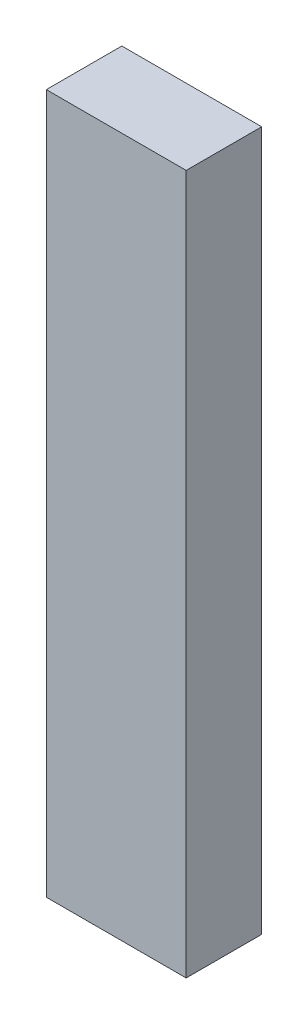
ISO-10303-21;
HEADER;
FILE_DESCRIPTION(('STEP AP214'),'2;1');
FILE_NAME('part.step','',(''),(''),'','','');
FILE_SCHEMA(('AUTOMOTIVE_DESIGN { 1 0 10303 214 1 1 1 1 }'));
ENDSEC;
DATA;
#1=APPLICATION_CONTEXT('core data for automotive mechanical design processes');
#2=APPLICATION_PROTOCOL_DEFINITION('international standard','automotive_design',2000,#1);
#3=PRODUCT_CONTEXT('',#1,'mechanical');
#4=PRODUCT('Part','Part','',(#3));
#5=PRODUCT_RELATED_PRODUCT_CATEGORY('part','',(#4));
#6=PRODUCT_DEFINITION_FORMATION('','',#4);
#7=PRODUCT_DEFINITION_CONTEXT('part definition',#1,'design');
#8=PRODUCT_DEFINITION('design','',#6,#7);
#9=PRODUCT_DEFINITION_SHAPE('','',#8);
#10=(LENGTH_UNIT() NAMED_UNIT(*) SI_UNIT(.MILLI.,.METRE.));
#11=(NAMED_UNIT(*) PLANE_ANGLE_UNIT() SI_UNIT($,.RADIAN.));
#12=(NAMED_UNIT(*) SI_UNIT($,.STERADIAN.) SOLID_ANGLE_UNIT());
#13=UNCERTAINTY_MEASURE_WITH_UNIT(LENGTH_MEASURE(1.E-05),#10,'distance_accuracy_value','');
#14=(GEOMETRIC_REPRESENTATION_CONTEXT(3) GLOBAL_UNCERTAINTY_ASSIGNED_CONTEXT((#13)) GLOBAL_UNIT_ASSIGNED_CONTEXT((#10,
#11,#12)) REPRESENTATION_CONTEXT('',''));
#15=CARTESIAN_POINT('',(0.,0.,0.));
#16=DIRECTION('',(0.,0.,1.));
#17=DIRECTION('',(1.,0.,0.));
#18=AXIS2_PLACEMENT_3D('',#15,#16,#17);
#19=CARTESIAN_POINT('',(50.,500.,27.));
#20=DIRECTION('',(-1.,0.,0.));
#21=DIRECTION('',(0.,0.,1.));
#22=AXIS2_PLACEMENT_3D('',#19,#20,#21);
#23=PLANE('',#22);
#24=DIRECTION('',(0.,0.,-1.));
#25=VECTOR('',#24,1.);
#26=CARTESIAN_POINT('',(50.,0.,27.));
#27=LINE('',#26,#25);
#28=CARTESIAN_POINT('',(50.,0.,27.));
#29=VERTEX_POINT('',#28);
#30=CARTESIAN_POINT('',(50.,0.,-27.));
#31=VERTEX_POINT('',#30);
#32=EDGE_CURVE('E113',#29,#31,#27,.T.);
#33=ORIENTED_EDGE('',*,*,#32,.T.);
#34=DIRECTION('',(0.,-1.,0.));
#35=VECTOR('',#34,1.);
#36=CARTESIAN_POINT('',(50.,500.,-27.));
#37=LINE('',#36,#35);
#38=CARTESIAN_POINT('',(50.,500.,-27.));
#39=VERTEX_POINT('',#38);
#40=EDGE_CURVE('E11',#39,#31,#37,.T.);
#41=ORIENTED_EDGE('',*,*,#40,.F.);
#42=DIRECTION('',(0.,0.,-1.));
#43=VECTOR('',#42,1.);
#44=CARTESIAN_POINT('',(50.,500.,27.));
#45=LINE('',#44,#43);
#46=CARTESIAN_POINT('',(50.,500.,27.));
#47=VERTEX_POINT('',#46);
#48=EDGE_CURVE('E95',#47,#39,#45,.T.);
#49=ORIENTED_EDGE('',*,*,#48,.F.);
#50=DIRECTION('',(0.,-1.,0.));
#51=VECTOR('',#50,1.);
#52=CARTESIAN_POINT('',(50.,500.,27.));
#53=LINE('',#52,#51);
#54=EDGE_CURVE('E62',#47,#29,#53,.T.);
#55=ORIENTED_EDGE('',*,*,#54,.T.);
#56=EDGE_LOOP('',(#33,#41,#49,#55));
#57=FACE_BOUND('',#56,.T.);
#58=ADVANCED_FACE('F45',(#57),#23,.F.);
#59=CARTESIAN_POINT('',(50.,500.,-27.));
#60=DIRECTION('',(0.,0.,1.));
#61=DIRECTION('',(1.,0.,0.));
#62=AXIS2_PLACEMENT_3D('',#59,#60,#61);
#63=PLANE('',#62);
#64=DIRECTION('',(-1.,0.,0.));
#65=VECTOR('',#64,1.);
#66=CARTESIAN_POINT('',(50.,0.,-27.));
#67=LINE('',#66,#65);
#68=CARTESIAN_POINT('',(-50.,0.,-27.));
#69=VERTEX_POINT('',#68);
#70=EDGE_CURVE('E101',#31,#69,#67,.T.);
#71=ORIENTED_EDGE('',*,*,#70,.T.);
#72=DIRECTION('',(0.,-1.,0.));
#73=VECTOR('',#72,1.);
#74=CARTESIAN_POINT('',(-50.,500.,-27.));
#75=LINE('',#74,#73);
#76=CARTESIAN_POINT('',(-50.,500.,-27.));
#77=VERTEX_POINT('',#76);
#78=EDGE_CURVE('E54',#77,#69,#75,.T.);
#79=ORIENTED_EDGE('',*,*,#78,.F.);
#80=DIRECTION('',(-1.,0.,0.));
#81=VECTOR('',#80,1.);
#82=CARTESIAN_POINT('',(50.,500.,-27.));
#83=LINE('',#82,#81);
#84=EDGE_CURVE('E87',#39,#77,#83,.T.);
#85=ORIENTED_EDGE('',*,*,#84,.F.);
#86=ORIENTED_EDGE('',*,*,#40,.T.);
#87=EDGE_LOOP('',(#71,#79,#85,#86));
#88=FACE_BOUND('',#87,.T.);
#89=ADVANCED_FACE('F100',(#88),#63,.F.);
#90=CARTESIAN_POINT('',(-50.,500.,27.));
#91=DIRECTION('',(-1.,0.,0.));
#92=DIRECTION('',(0.,0.,1.));
#93=AXIS2_PLACEMENT_3D('',#90,#91,#92);
#94=PLANE('',#93);
#95=DIRECTION('',(0.,0.,-1.));
#96=VECTOR('',#95,1.);
#97=CARTESIAN_POINT('',(-50.,0.,27.));
#98=LINE('',#97,#96);
#99=CARTESIAN_POINT('',(-50.,0.,27.));
#100=VERTEX_POINT('',#99);
#101=EDGE_CURVE('E118',#100,#69,#98,.T.);
#102=ORIENTED_EDGE('',*,*,#101,.F.);
#103=DIRECTION('',(0.,-1.,0.));
#104=VECTOR('',#103,1.);
#105=CARTESIAN_POINT('',(-50.,500.,27.));
#106=LINE('',#105,#104);
#107=CARTESIAN_POINT('',(-50.,500.,27.));
#108=VERTEX_POINT('',#107);
#109=EDGE_CURVE('E76',#108,#100,#106,.T.);
#110=ORIENTED_EDGE('',*,*,#109,.F.);
#111=DIRECTION('',(0.,0.,-1.));
#112=VECTOR('',#111,1.);
#113=CARTESIAN_POINT('',(-50.,500.,27.));
#114=LINE('',#113,#112);
#115=EDGE_CURVE('E94',#108,#77,#114,.T.);
#116=ORIENTED_EDGE('',*,*,#115,.T.);
#117=ORIENTED_EDGE('',*,*,#78,.T.);
#118=EDGE_LOOP('',(#102,#110,#116,#117));
#119=FACE_BOUND('',#118,.T.);
#120=ADVANCED_FACE('F105',(#119),#94,.T.);
#121=CARTESIAN_POINT('',(50.,500.,27.));
#122=DIRECTION('',(0.,0.,1.));
#123=DIRECTION('',(1.,0.,0.));
#124=AXIS2_PLACEMENT_3D('',#121,#122,#123);
#125=PLANE('',#124);
#126=DIRECTION('',(-1.,0.,0.));
#127=VECTOR('',#126,1.);
#128=CARTESIAN_POINT('',(50.,0.,27.));
#129=LINE('',#128,#127);
#130=EDGE_CURVE('E121',#29,#100,#129,.T.);
#131=ORIENTED_EDGE('',*,*,#130,.F.);
#132=ORIENTED_EDGE('',*,*,#54,.F.);
#133=DIRECTION('',(-1.,0.,0.));
#134=VECTOR('',#133,1.);
#135=CARTESIAN_POINT('',(50.,500.,27.));
#136=LINE('',#135,#134);
#137=EDGE_CURVE('E107',#47,#108,#136,.T.);
#138=ORIENTED_EDGE('',*,*,#137,.T.);
#139=ORIENTED_EDGE('',*,*,#109,.T.);
#140=EDGE_LOOP('',(#131,#132,#138,#139));
#141=FACE_BOUND('',#140,.T.);
#142=ADVANCED_FACE('F131',(#141),#125,.T.);
#143=CARTESIAN_POINT('',(0.,500.,0.));
#144=DIRECTION('',(0.,1.,0.));
#145=DIRECTION('',(0.,0.,1.));
#146=AXIS2_PLACEMENT_3D('',#143,#144,#145);
#147=PLANE('',#146);
#148=ORIENTED_EDGE('',*,*,#48,.T.);
#149=ORIENTED_EDGE('',*,*,#84,.T.);
#150=ORIENTED_EDGE('',*,*,#115,.F.);
#151=ORIENTED_EDGE('',*,*,#137,.F.);
#152=EDGE_LOOP('',(#148,#149,#150,#151));
#153=FACE_BOUND('',#152,.T.);
#154=ADVANCED_FACE('F91',(#153),#147,.T.);
#155=CARTESIAN_POINT('',(0.,0.,0.));
#156=DIRECTION('',(0.,1.,0.));
#157=DIRECTION('',(0.,0.,1.));
#158=AXIS2_PLACEMENT_3D('',#155,#156,#157);
#159=PLANE('',#158);
#160=ORIENTED_EDGE('',*,*,#32,.F.);
#161=ORIENTED_EDGE('',*,*,#130,.T.);
#162=ORIENTED_EDGE('',*,*,#101,.T.);
#163=ORIENTED_EDGE('',*,*,#70,.F.);
#164=EDGE_LOOP('',(#160,#161,#162,#163));
#165=FACE_BOUND('',#164,.T.);
#166=ADVANCED_FACE('F130',(#165),#159,.F.);
#167=CLOSED_SHELL('',(#58,#89,#120,#142,#154,#166));
#168=MANIFOLD_SOLID_BREP('B2',#167);
#169=ADVANCED_BREP_SHAPE_REPRESENTATION('',(#18,#168),#14);
#170=SHAPE_DEFINITION_REPRESENTATION(#9,#169);
ENDSEC;
END-ISO-10303-21;
